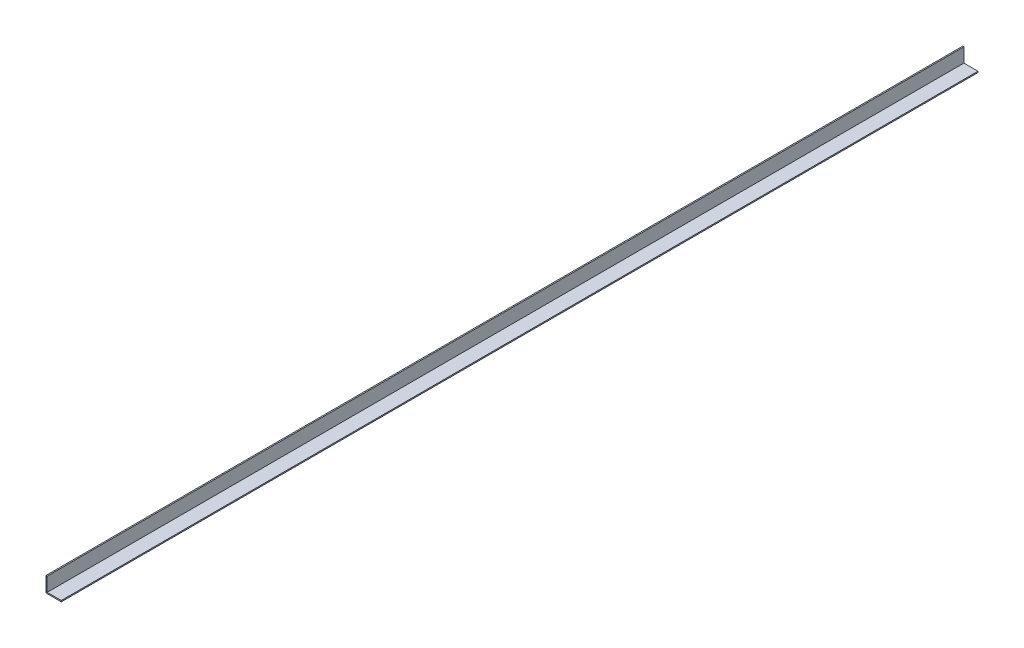
ISO-10303-21;
HEADER;
FILE_DESCRIPTION(('STEP AP214'),'2;1');
FILE_NAME('part.step','',(''),(''),'','','');
FILE_SCHEMA(('AUTOMOTIVE_DESIGN { 1 0 10303 214 1 1 1 1 }'));
ENDSEC;
DATA;
#1=APPLICATION_CONTEXT('core data for automotive mechanical design processes');
#2=APPLICATION_PROTOCOL_DEFINITION('international standard','automotive_design',2000,#1);
#3=PRODUCT_CONTEXT('',#1,'mechanical');
#4=PRODUCT('Part','Part','',(#3));
#5=PRODUCT_RELATED_PRODUCT_CATEGORY('part','',(#4));
#6=PRODUCT_DEFINITION_FORMATION('','',#4);
#7=PRODUCT_DEFINITION_CONTEXT('part definition',#1,'design');
#8=PRODUCT_DEFINITION('design','',#6,#7);
#9=PRODUCT_DEFINITION_SHAPE('','',#8);
#10=(LENGTH_UNIT() NAMED_UNIT(*) SI_UNIT(.MILLI.,.METRE.));
#11=(NAMED_UNIT(*) PLANE_ANGLE_UNIT() SI_UNIT($,.RADIAN.));
#12=(NAMED_UNIT(*) SI_UNIT($,.STERADIAN.) SOLID_ANGLE_UNIT());
#13=UNCERTAINTY_MEASURE_WITH_UNIT(LENGTH_MEASURE(1.E-05),#10,'distance_accuracy_value','');
#14=(GEOMETRIC_REPRESENTATION_CONTEXT(3) GLOBAL_UNCERTAINTY_ASSIGNED_CONTEXT((#13)) GLOBAL_UNIT_ASSIGNED_CONTEXT((#10,
#11,#12)) REPRESENTATION_CONTEXT('',''));
#15=CARTESIAN_POINT('',(0.,0.,0.));
#16=DIRECTION('',(0.,0.,1.));
#17=DIRECTION('',(1.,0.,0.));
#18=AXIS2_PLACEMENT_3D('',#15,#16,#17);
#19=CARTESIAN_POINT('',(7.94,101.6,-6100.));
#20=DIRECTION('',(0.,1.,0.));
#21=DIRECTION('',(0.,0.,1.));
#22=AXIS2_PLACEMENT_3D('',#19,#20,#21);
#23=PLANE('',#22);
#24=DIRECTION('',(-1.,0.,0.));
#25=VECTOR('',#24,1.);
#26=CARTESIAN_POINT('',(7.94,101.6,0.));
#27=LINE('',#26,#25);
#28=CARTESIAN_POINT('',(7.94,101.6,0.));
#29=VERTEX_POINT('',#28);
#30=CARTESIAN_POINT('',(0.,101.6,0.));
#31=VERTEX_POINT('',#30);
#32=EDGE_CURVE('E118',#29,#31,#27,.T.);
#33=ORIENTED_EDGE('',*,*,#32,.F.);
#34=DIRECTION('',(0.,0.,1.));
#35=VECTOR('',#34,1.);
#36=CARTESIAN_POINT('',(7.94,101.6,-6100.));
#37=LINE('',#36,#35);
#38=CARTESIAN_POINT('',(7.94,101.6,-6100.));
#39=VERTEX_POINT('',#38);
#40=EDGE_CURVE('E11',#39,#29,#37,.T.);
#41=ORIENTED_EDGE('',*,*,#40,.F.);
#42=DIRECTION('',(-1.,0.,0.));
#43=VECTOR('',#42,1.);
#44=CARTESIAN_POINT('',(7.94,101.6,-6100.));
#45=LINE('',#44,#43);
#46=CARTESIAN_POINT('',(0.,101.6,-6100.));
#47=VERTEX_POINT('',#46);
#48=EDGE_CURVE('E132',#39,#47,#45,.T.);
#49=ORIENTED_EDGE('',*,*,#48,.T.);
#50=DIRECTION('',(0.,0.,1.));
#51=VECTOR('',#50,1.);
#52=CARTESIAN_POINT('',(0.,101.6,-6100.));
#53=LINE('',#52,#51);
#54=EDGE_CURVE('E36',#47,#31,#53,.T.);
#55=ORIENTED_EDGE('',*,*,#54,.T.);
#56=EDGE_LOOP('',(#33,#41,#49,#55));
#57=FACE_BOUND('',#56,.T.);
#58=ADVANCED_FACE('F33',(#57),#23,.T.);
#59=CARTESIAN_POINT('',(7.94,7.94,-6100.));
#60=DIRECTION('',(1.,0.,0.));
#61=DIRECTION('',(0.,1.,0.));
#62=AXIS2_PLACEMENT_3D('',#59,#60,#61);
#63=PLANE('',#62);
#64=DIRECTION('',(0.,1.,0.));
#65=VECTOR('',#64,1.);
#66=CARTESIAN_POINT('',(7.94,7.94,0.));
#67=LINE('',#66,#65);
#68=CARTESIAN_POINT('',(7.94,7.94,0.));
#69=VERTEX_POINT('',#68);
#70=EDGE_CURVE('E130',#69,#29,#67,.T.);
#71=ORIENTED_EDGE('',*,*,#70,.F.);
#72=DIRECTION('',(0.,0.,1.));
#73=VECTOR('',#72,1.);
#74=CARTESIAN_POINT('',(7.94,7.94,-6100.));
#75=LINE('',#74,#73);
#76=CARTESIAN_POINT('',(7.94,7.94,-6100.));
#77=VERTEX_POINT('',#76);
#78=EDGE_CURVE('E42',#77,#69,#75,.T.);
#79=ORIENTED_EDGE('',*,*,#78,.F.);
#80=DIRECTION('',(0.,1.,0.));
#81=VECTOR('',#80,1.);
#82=CARTESIAN_POINT('',(7.94,7.94,-6100.));
#83=LINE('',#82,#81);
#84=EDGE_CURVE('E108',#77,#39,#83,.T.);
#85=ORIENTED_EDGE('',*,*,#84,.T.);
#86=ORIENTED_EDGE('',*,*,#40,.T.);
#87=EDGE_LOOP('',(#71,#79,#85,#86));
#88=FACE_BOUND('',#87,.T.);
#89=ADVANCED_FACE('F140',(#88),#63,.T.);
#90=CARTESIAN_POINT('',(101.6,7.94,-6100.));
#91=DIRECTION('',(0.,1.,0.));
#92=DIRECTION('',(-1.,0.,0.));
#93=AXIS2_PLACEMENT_3D('',#90,#91,#92);
#94=PLANE('',#93);
#95=DIRECTION('',(-1.,0.,0.));
#96=VECTOR('',#95,1.);
#97=CARTESIAN_POINT('',(101.6,7.94,0.));
#98=LINE('',#97,#96);
#99=CARTESIAN_POINT('',(101.6,7.94,0.));
#100=VERTEX_POINT('',#99);
#101=EDGE_CURVE('E95',#100,#69,#98,.T.);
#102=ORIENTED_EDGE('',*,*,#101,.F.);
#103=DIRECTION('',(0.,0.,1.));
#104=VECTOR('',#103,1.);
#105=CARTESIAN_POINT('',(101.6,7.94,-6100.));
#106=LINE('',#105,#104);
#107=CARTESIAN_POINT('',(101.6,7.94,-6100.));
#108=VERTEX_POINT('',#107);
#109=EDGE_CURVE('E90',#108,#100,#106,.T.);
#110=ORIENTED_EDGE('',*,*,#109,.F.);
#111=DIRECTION('',(-1.,0.,0.));
#112=VECTOR('',#111,1.);
#113=CARTESIAN_POINT('',(101.6,7.94,-6100.));
#114=LINE('',#113,#112);
#115=EDGE_CURVE('E93',#108,#77,#114,.T.);
#116=ORIENTED_EDGE('',*,*,#115,.T.);
#117=ORIENTED_EDGE('',*,*,#78,.T.);
#118=EDGE_LOOP('',(#102,#110,#116,#117));
#119=FACE_BOUND('',#118,.T.);
#120=ADVANCED_FACE('F92',(#119),#94,.T.);
#121=CARTESIAN_POINT('',(101.6,0.,-6100.));
#122=DIRECTION('',(1.,0.,0.));
#123=DIRECTION('',(0.,0.,-1.));
#124=AXIS2_PLACEMENT_3D('',#121,#122,#123);
#125=PLANE('',#124);
#126=DIRECTION('',(0.,1.,0.));
#127=VECTOR('',#126,1.);
#128=CARTESIAN_POINT('',(101.6,0.,0.));
#129=LINE('',#128,#127);
#130=CARTESIAN_POINT('',(101.6,0.,0.));
#131=VERTEX_POINT('',#130);
#132=EDGE_CURVE('E127',#131,#100,#129,.T.);
#133=ORIENTED_EDGE('',*,*,#132,.F.);
#134=DIRECTION('',(0.,0.,1.));
#135=VECTOR('',#134,1.);
#136=CARTESIAN_POINT('',(101.6,0.,-6100.));
#137=LINE('',#136,#135);
#138=CARTESIAN_POINT('',(101.6,0.,-6100.));
#139=VERTEX_POINT('',#138);
#140=EDGE_CURVE('E100',#139,#131,#137,.T.);
#141=ORIENTED_EDGE('',*,*,#140,.F.);
#142=DIRECTION('',(0.,1.,0.));
#143=VECTOR('',#142,1.);
#144=CARTESIAN_POINT('',(101.6,0.,-6100.));
#145=LINE('',#144,#143);
#146=EDGE_CURVE('E106',#139,#108,#145,.T.);
#147=ORIENTED_EDGE('',*,*,#146,.T.);
#148=ORIENTED_EDGE('',*,*,#109,.T.);
#149=EDGE_LOOP('',(#133,#141,#147,#148));
#150=FACE_BOUND('',#149,.T.);
#151=ADVANCED_FACE('F110',(#150),#125,.T.);
#152=CARTESIAN_POINT('',(0.,0.,-6100.));
#153=DIRECTION('',(0.,-1.,0.));
#154=DIRECTION('',(0.,0.,-1.));
#155=AXIS2_PLACEMENT_3D('',#152,#153,#154);
#156=PLANE('',#155);
#157=DIRECTION('',(1.,0.,0.));
#158=VECTOR('',#157,1.);
#159=CARTESIAN_POINT('',(0.,0.,0.));
#160=LINE('',#159,#158);
#161=CARTESIAN_POINT('',(0.,0.,0.));
#162=VERTEX_POINT('',#161);
#163=EDGE_CURVE('E124',#162,#131,#160,.T.);
#164=ORIENTED_EDGE('',*,*,#163,.F.);
#165=DIRECTION('',(0.,0.,1.));
#166=VECTOR('',#165,1.);
#167=CARTESIAN_POINT('',(0.,0.,-6100.));
#168=LINE('',#167,#166);
#169=CARTESIAN_POINT('',(0.,0.,-6100.));
#170=VERTEX_POINT('',#169);
#171=EDGE_CURVE('E135',#170,#162,#168,.T.);
#172=ORIENTED_EDGE('',*,*,#171,.F.);
#173=DIRECTION('',(1.,0.,0.));
#174=VECTOR('',#173,1.);
#175=CARTESIAN_POINT('',(0.,0.,-6100.));
#176=LINE('',#175,#174);
#177=EDGE_CURVE('E111',#170,#139,#176,.T.);
#178=ORIENTED_EDGE('',*,*,#177,.T.);
#179=ORIENTED_EDGE('',*,*,#140,.T.);
#180=EDGE_LOOP('',(#164,#172,#178,#179));
#181=FACE_BOUND('',#180,.T.);
#182=ADVANCED_FACE('F153',(#181),#156,.T.);
#183=CARTESIAN_POINT('',(0.,101.6,-6100.));
#184=DIRECTION('',(-1.,0.,0.));
#185=DIRECTION('',(0.,-1.,0.));
#186=AXIS2_PLACEMENT_3D('',#183,#184,#185);
#187=PLANE('',#186);
#188=DIRECTION('',(0.,-1.,0.));
#189=VECTOR('',#188,1.);
#190=CARTESIAN_POINT('',(0.,101.6,0.));
#191=LINE('',#190,#189);
#192=EDGE_CURVE('E121',#31,#162,#191,.T.);
#193=ORIENTED_EDGE('',*,*,#192,.F.);
#194=ORIENTED_EDGE('',*,*,#54,.F.);
#195=DIRECTION('',(0.,-1.,0.));
#196=VECTOR('',#195,1.);
#197=CARTESIAN_POINT('',(0.,101.6,-6100.));
#198=LINE('',#197,#196);
#199=EDGE_CURVE('E113',#47,#170,#198,.T.);
#200=ORIENTED_EDGE('',*,*,#199,.T.);
#201=ORIENTED_EDGE('',*,*,#171,.T.);
#202=EDGE_LOOP('',(#193,#194,#200,#201));
#203=FACE_BOUND('',#202,.T.);
#204=ADVANCED_FACE('F137',(#203),#187,.T.);
#205=CARTESIAN_POINT('',(0.,0.,-6100.));
#206=DIRECTION('',(0.,0.,1.));
#207=DIRECTION('',(1.,0.,0.));
#208=AXIS2_PLACEMENT_3D('',#205,#206,#207);
#209=PLANE('',#208);
#210=ORIENTED_EDGE('',*,*,#48,.F.);
#211=ORIENTED_EDGE('',*,*,#84,.F.);
#212=ORIENTED_EDGE('',*,*,#115,.F.);
#213=ORIENTED_EDGE('',*,*,#146,.F.);
#214=ORIENTED_EDGE('',*,*,#177,.F.);
#215=ORIENTED_EDGE('',*,*,#199,.F.);
#216=EDGE_LOOP('',(#210,#211,#212,#213,#214,#215));
#217=FACE_BOUND('',#216,.T.);
#218=ADVANCED_FACE('F104',(#217),#209,.F.);
#219=CARTESIAN_POINT('',(0.,0.,0.));
#220=DIRECTION('',(0.,0.,1.));
#221=DIRECTION('',(1.,0.,0.));
#222=AXIS2_PLACEMENT_3D('',#219,#220,#221);
#223=PLANE('',#222);
#224=ORIENTED_EDGE('',*,*,#32,.T.);
#225=ORIENTED_EDGE('',*,*,#192,.T.);
#226=ORIENTED_EDGE('',*,*,#163,.T.);
#227=ORIENTED_EDGE('',*,*,#132,.T.);
#228=ORIENTED_EDGE('',*,*,#101,.T.);
#229=ORIENTED_EDGE('',*,*,#70,.T.);
#230=EDGE_LOOP('',(#224,#225,#226,#227,#228,#229));
#231=FACE_BOUND('',#230,.T.);
#232=ADVANCED_FACE('F139',(#231),#223,.T.);
#233=CLOSED_SHELL('',(#58,#89,#120,#151,#182,#204,#218,#232));
#234=MANIFOLD_SOLID_BREP('B2',#233);
#235=ADVANCED_BREP_SHAPE_REPRESENTATION('',(#18,#234),#14);
#236=SHAPE_DEFINITION_REPRESENTATION(#9,#235);
ENDSEC;
END-ISO-10303-21;
